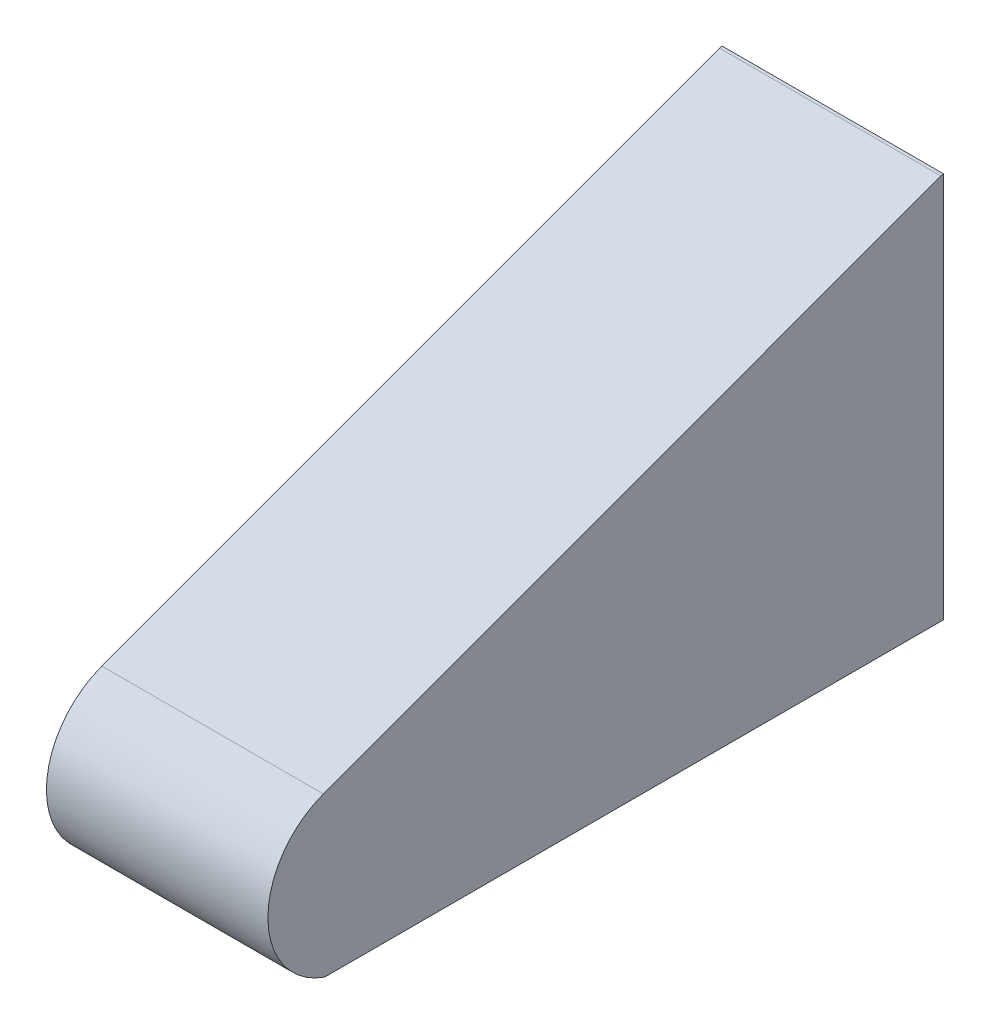
ISO-10303-21;
HEADER;
FILE_DESCRIPTION(('STEP AP214'),'2;1');
FILE_NAME('part.step','',(''),(''),'','','');
FILE_SCHEMA(('AUTOMOTIVE_DESIGN { 1 0 10303 214 1 1 1 1 }'));
ENDSEC;
DATA;
#1=APPLICATION_CONTEXT('core data for automotive mechanical design processes');
#2=APPLICATION_PROTOCOL_DEFINITION('international standard','automotive_design',2000,#1);
#3=PRODUCT_CONTEXT('',#1,'mechanical');
#4=PRODUCT('Part','Part','',(#3));
#5=PRODUCT_RELATED_PRODUCT_CATEGORY('part','',(#4));
#6=PRODUCT_DEFINITION_FORMATION('','',#4);
#7=PRODUCT_DEFINITION_CONTEXT('part definition',#1,'design');
#8=PRODUCT_DEFINITION('design','',#6,#7);
#9=PRODUCT_DEFINITION_SHAPE('','',#8);
#10=(LENGTH_UNIT() NAMED_UNIT(*) SI_UNIT(.MILLI.,.METRE.));
#11=(NAMED_UNIT(*) PLANE_ANGLE_UNIT() SI_UNIT($,.RADIAN.));
#12=(NAMED_UNIT(*) SI_UNIT($,.STERADIAN.) SOLID_ANGLE_UNIT());
#13=UNCERTAINTY_MEASURE_WITH_UNIT(LENGTH_MEASURE(1.E-05),#10,'distance_accuracy_value','');
#14=(GEOMETRIC_REPRESENTATION_CONTEXT(3) GLOBAL_UNCERTAINTY_ASSIGNED_CONTEXT((#13)) GLOBAL_UNIT_ASSIGNED_CONTEXT((#10,
#11,#12)) REPRESENTATION_CONTEXT('',''));
#15=CARTESIAN_POINT('',(0.,0.,0.));
#16=DIRECTION('',(0.,0.,1.));
#17=DIRECTION('',(1.,0.,0.));
#18=AXIS2_PLACEMENT_3D('',#15,#16,#17);
#19=CARTESIAN_POINT('',(-63.5,-119.126,0.));
#20=DIRECTION('',(0.,-1.,0.));
#21=DIRECTION('',(0.,0.,-1.));
#22=AXIS2_PLACEMENT_3D('',#19,#20,#21);
#23=PLANE('',#22);
#24=DIRECTION('',(1.,0.,0.));
#25=VECTOR('',#24,1.);
#26=CARTESIAN_POINT('',(-63.5,-119.126,0.));
#27=LINE('',#26,#25);
#28=CARTESIAN_POINT('',(-68.326,-119.126,0.));
#29=VERTEX_POINT('',#28);
#30=CARTESIAN_POINT('',(68.326,-119.126,0.));
#31=VERTEX_POINT('',#30);
#32=EDGE_CURVE('E11',#29,#31,#27,.T.);
#33=ORIENTED_EDGE('',*,*,#32,.T.);
#34=DIRECTION('',(0.,0.,-1.));
#35=VECTOR('',#34,1.);
#36=CARTESIAN_POINT('',(68.326,-119.126,381.835461036486));
#37=LINE('',#36,#35);
#38=CARTESIAN_POINT('',(68.326,-119.126,381.835461036486));
#39=VERTEX_POINT('',#38);
#40=EDGE_CURVE('E157',#39,#31,#37,.T.);
#41=ORIENTED_EDGE('',*,*,#40,.F.);
#42=DIRECTION('',(1.,0.,0.));
#43=VECTOR('',#42,1.);
#44=CARTESIAN_POINT('',(-63.5,-119.126,381.835461036486));
#45=LINE('',#44,#43);
#46=CARTESIAN_POINT('',(-68.326,-119.126,381.835461036486));
#47=VERTEX_POINT('',#46);
#48=EDGE_CURVE('E49',#47,#39,#45,.T.);
#49=ORIENTED_EDGE('',*,*,#48,.F.);
#50=DIRECTION('',(0.,0.,-1.));
#51=VECTOR('',#50,1.);
#52=CARTESIAN_POINT('',(-68.326,-119.126,381.835461036486));
#53=LINE('',#52,#51);
#54=EDGE_CURVE('E135',#47,#29,#53,.T.);
#55=ORIENTED_EDGE('',*,*,#54,.T.);
#56=EDGE_LOOP('',(#33,#41,#49,#55));
#57=FACE_BOUND('',#56,.T.);
#58=ADVANCED_FACE('F39',(#57),#23,.T.);
#59=CARTESIAN_POINT('',(-63.5,-69.8500000000001,364.701666666667));
#60=DIRECTION('',(1.,0.,0.));
#61=DIRECTION('',(0.,0.,-1.));
#62=AXIS2_PLACEMENT_3D('',#59,#60,#61);
#63=CYLINDRICAL_SURFACE('',#62,52.1698292646935);
#64=ORIENTED_EDGE('',*,*,#48,.T.);
#65=CARTESIAN_POINT('',(68.326,-69.8500000000001,364.701666666667));
#66=DIRECTION('',(1.,0.,0.));
#67=DIRECTION('',(0.,0.,-1.));
#68=AXIS2_PLACEMENT_3D('',#65,#66,#67);
#69=CIRCLE('',#68,52.1698292646935);
#70=CARTESIAN_POINT('',(68.326,-20.8689828995313,382.661372936839));
#71=VERTEX_POINT('',#70);
#72=EDGE_CURVE('E119',#71,#39,#69,.T.);
#73=ORIENTED_EDGE('',*,*,#72,.F.);
#74=DIRECTION('',(1.,0.,0.));
#75=VECTOR('',#74,1.);
#76=CARTESIAN_POINT('',(-63.5,-20.8689828995313,382.661372936839));
#77=LINE('',#76,#75);
#78=CARTESIAN_POINT('',(-68.326,-20.8689828995313,382.661372936839));
#79=VERTEX_POINT('',#78);
#80=EDGE_CURVE('E113',#79,#71,#77,.T.);
#81=ORIENTED_EDGE('',*,*,#80,.F.);
#82=CARTESIAN_POINT('',(-68.326,-69.8500000000001,364.701666666667));
#83=DIRECTION('',(1.,0.,0.));
#84=DIRECTION('',(0.,0.,-1.));
#85=AXIS2_PLACEMENT_3D('',#82,#83,#84);
#86=CIRCLE('',#85,52.1698292646935);
#87=EDGE_CURVE('E116',#79,#47,#86,.T.);
#88=ORIENTED_EDGE('',*,*,#87,.T.);
#89=EDGE_LOOP('',(#64,#73,#81,#88));
#90=FACE_BOUND('',#89,.T.);
#91=ADVANCED_FACE('F115',(#90),#63,.T.);
#92=CARTESIAN_POINT('',(-63.5,-20.8689828995313,382.661372936839));
#93=DIRECTION('',(0.,0.938876315886608,0.344254649158423));
#94=DIRECTION('',(0.,-0.344254649158423,0.938876315886609));
#95=AXIS2_PLACEMENT_3D('',#92,#93,#94);
#96=PLANE('',#95);
#97=ORIENTED_EDGE('',*,*,#80,.T.);
#98=DIRECTION('',(0.,-0.344254649158423,0.938876315886609));
#99=VECTOR('',#98,1.);
#100=CARTESIAN_POINT('',(68.326,118.831017100469,1.6613729368385));
#101=LINE('',#100,#99);
#102=CARTESIAN_POINT('',(68.326,118.831017100469,1.6613729368385));
#103=VERTEX_POINT('',#102);
#104=EDGE_CURVE('E169',#103,#71,#101,.T.);
#105=ORIENTED_EDGE('',*,*,#104,.F.);
#106=DIRECTION('',(1.,0.,0.));
#107=VECTOR('',#106,1.);
#108=CARTESIAN_POINT('',(-63.5,118.831017100469,1.6613729368385));
#109=LINE('',#108,#107);
#110=CARTESIAN_POINT('',(-68.326,118.831017100469,1.6613729368385));
#111=VERTEX_POINT('',#110);
#112=EDGE_CURVE('E125',#111,#103,#109,.T.);
#113=ORIENTED_EDGE('',*,*,#112,.F.);
#114=DIRECTION('',(0.,-0.344254649158423,0.938876315886609));
#115=VECTOR('',#114,1.);
#116=CARTESIAN_POINT('',(-68.326,118.831017100469,1.6613729368385));
#117=LINE('',#116,#115);
#118=EDGE_CURVE('E131',#111,#79,#117,.T.);
#119=ORIENTED_EDGE('',*,*,#118,.T.);
#120=EDGE_LOOP('',(#97,#105,#113,#119));
#121=FACE_BOUND('',#120,.T.);
#122=ADVANCED_FACE('F139',(#121),#96,.T.);
#123=CARTESIAN_POINT('',(-63.5,118.831017100469,1.6613729368385));
#124=DIRECTION('',(0.,0.984600506775875,0.174819455601169));
#125=DIRECTION('',(0.,-0.174819455601169,0.984600506775876));
#126=AXIS2_PLACEMENT_3D('',#123,#124,#125);
#127=PLANE('',#126);
#128=ORIENTED_EDGE('',*,*,#112,.T.);
#129=DIRECTION('',(0.,-0.174819455601169,0.984600506775875));
#130=VECTOR('',#129,1.);
#131=CARTESIAN_POINT('',(68.326,119.126,0.));
#132=LINE('',#131,#130);
#133=CARTESIAN_POINT('',(68.326,119.126,0.));
#134=VERTEX_POINT('',#133);
#135=EDGE_CURVE('E165',#134,#103,#132,.T.);
#136=ORIENTED_EDGE('',*,*,#135,.F.);
#137=DIRECTION('',(1.,0.,0.));
#138=VECTOR('',#137,1.);
#139=CARTESIAN_POINT('',(-63.5,119.126,0.));
#140=LINE('',#139,#138);
#141=CARTESIAN_POINT('',(-68.326,119.126,0.));
#142=VERTEX_POINT('',#141);
#143=EDGE_CURVE('E201',#142,#134,#140,.T.);
#144=ORIENTED_EDGE('',*,*,#143,.F.);
#145=DIRECTION('',(0.,-0.174819455601169,0.984600506775875));
#146=VECTOR('',#145,1.);
#147=CARTESIAN_POINT('',(-68.326,119.126,0.));
#148=LINE('',#147,#146);
#149=EDGE_CURVE('E141',#142,#111,#148,.T.);
#150=ORIENTED_EDGE('',*,*,#149,.T.);
#151=EDGE_LOOP('',(#128,#136,#144,#150));
#152=FACE_BOUND('',#151,.T.);
#153=ADVANCED_FACE('F244',(#152),#127,.T.);
#154=CARTESIAN_POINT('',(-63.5,114.3,0.));
#155=DIRECTION('',(0.,0.,-1.));
#156=DIRECTION('',(-1.,0.,0.));
#157=AXIS2_PLACEMENT_3D('',#154,#155,#156);
#158=PLANE('',#157);
#159=DIRECTION('',(0.,1.,0.));
#160=VECTOR('',#159,1.);
#161=CARTESIAN_POINT('',(-63.5,119.126,0.));
#162=LINE('',#161,#160);
#163=CARTESIAN_POINT('',(-63.5,-114.3,0.));
#164=VERTEX_POINT('',#163);
#165=CARTESIAN_POINT('',(-63.5,114.3,0.));
#166=VERTEX_POINT('',#165);
#167=EDGE_CURVE('E137',#164,#166,#162,.T.);
#168=ORIENTED_EDGE('',*,*,#167,.F.);
#169=DIRECTION('',(1.,0.,0.));
#170=VECTOR('',#169,1.);
#171=CARTESIAN_POINT('',(-63.5,-114.3,0.));
#172=LINE('',#171,#170);
#173=CARTESIAN_POINT('',(63.5,-114.3,0.));
#174=VERTEX_POINT('',#173);
#175=EDGE_CURVE('E43',#164,#174,#172,.T.);
#176=ORIENTED_EDGE('',*,*,#175,.T.);
#177=DIRECTION('',(0.,1.,0.));
#178=VECTOR('',#177,1.);
#179=CARTESIAN_POINT('',(63.5,119.126,0.));
#180=LINE('',#179,#178);
#181=CARTESIAN_POINT('',(63.5,114.3,0.));
#182=VERTEX_POINT('',#181);
#183=EDGE_CURVE('E152',#174,#182,#180,.T.);
#184=ORIENTED_EDGE('',*,*,#183,.T.);
#185=DIRECTION('',(1.,0.,0.));
#186=VECTOR('',#185,1.);
#187=CARTESIAN_POINT('',(-63.5,114.3,0.));
#188=LINE('',#187,#186);
#189=EDGE_CURVE('E204',#166,#182,#188,.T.);
#190=ORIENTED_EDGE('',*,*,#189,.F.);
#191=EDGE_LOOP('',(#168,#176,#184,#190));
#192=FACE_BOUND('',#191,.T.);
#193=ORIENTED_EDGE('',*,*,#143,.T.);
#194=DIRECTION('',(0.,1.,0.));
#195=VECTOR('',#194,1.);
#196=CARTESIAN_POINT('',(68.326,119.126,0.));
#197=LINE('',#196,#195);
#198=EDGE_CURVE('E161',#31,#134,#197,.T.);
#199=ORIENTED_EDGE('',*,*,#198,.F.);
#200=ORIENTED_EDGE('',*,*,#32,.F.);
#201=DIRECTION('',(0.,1.,0.));
#202=VECTOR('',#201,1.);
#203=CARTESIAN_POINT('',(-68.326,119.126,0.));
#204=LINE('',#203,#202);
#205=EDGE_CURVE('E144',#29,#142,#204,.T.);
#206=ORIENTED_EDGE('',*,*,#205,.T.);
#207=EDGE_LOOP('',(#193,#199,#200,#206));
#208=FACE_BOUND('',#207,.T.);
#209=ADVANCED_FACE('F216',(#192,#208),#158,.T.);
#210=CARTESIAN_POINT('',(-63.5,-25.4,381.));
#211=DIRECTION('',(0.,-0.938876315886609,-0.344254649158423));
#212=DIRECTION('',(0.,0.344254649158423,-0.938876315886609));
#213=AXIS2_PLACEMENT_3D('',#210,#211,#212);
#214=PLANE('',#213);
#215=ORIENTED_EDGE('',*,*,#189,.T.);
#216=DIRECTION('',(0.,0.344254649158423,-0.938876315886609));
#217=VECTOR('',#216,1.);
#218=CARTESIAN_POINT('',(63.5,-25.4,381.));
#219=LINE('',#218,#217);
#220=CARTESIAN_POINT('',(63.5,-25.4000000000001,381.));
#221=VERTEX_POINT('',#220);
#222=EDGE_CURVE('E183',#221,#182,#219,.T.);
#223=ORIENTED_EDGE('',*,*,#222,.F.);
#224=DIRECTION('',(1.,0.,0.));
#225=VECTOR('',#224,1.);
#226=CARTESIAN_POINT('',(-63.5,-25.4000000000001,381.));
#227=LINE('',#226,#225);
#228=CARTESIAN_POINT('',(-63.5,-25.4000000000001,381.));
#229=VERTEX_POINT('',#228);
#230=EDGE_CURVE('E64',#229,#221,#227,.T.);
#231=ORIENTED_EDGE('',*,*,#230,.F.);
#232=DIRECTION('',(0.,0.344254649158423,-0.938876315886609));
#233=VECTOR('',#232,1.);
#234=CARTESIAN_POINT('',(-63.5,-25.4,381.));
#235=LINE('',#234,#233);
#236=EDGE_CURVE('E193',#229,#166,#235,.T.);
#237=ORIENTED_EDGE('',*,*,#236,.T.);
#238=EDGE_LOOP('',(#215,#223,#231,#237));
#239=FACE_BOUND('',#238,.T.);
#240=ADVANCED_FACE('F223',(#239),#214,.T.);
#241=CARTESIAN_POINT('',(-63.5,-69.8500000000001,364.701666666667));
#242=DIRECTION('',(1.,0.,0.));
#243=DIRECTION('',(0.,0.,-1.));
#244=AXIS2_PLACEMENT_3D('',#241,#242,#243);
#245=CYLINDRICAL_SURFACE('',#244,47.3438292646935);
#246=ORIENTED_EDGE('',*,*,#230,.T.);
#247=CARTESIAN_POINT('',(63.5,-69.8500000000001,364.701666666667));
#248=DIRECTION('',(-1.,0.,0.));
#249=DIRECTION('',(0.,0.,-1.));
#250=AXIS2_PLACEMENT_3D('',#247,#248,#249);
#251=CIRCLE('',#250,47.3438292646935);
#252=CARTESIAN_POINT('',(63.5,-114.3,381.));
#253=VERTEX_POINT('',#252);
#254=EDGE_CURVE('E179',#253,#221,#251,.T.);
#255=ORIENTED_EDGE('',*,*,#254,.F.);
#256=DIRECTION('',(1.,0.,0.));
#257=VECTOR('',#256,1.);
#258=CARTESIAN_POINT('',(-63.5,-114.3,381.));
#259=LINE('',#258,#257);
#260=CARTESIAN_POINT('',(-63.5,-114.3,381.));
#261=VERTEX_POINT('',#260);
#262=EDGE_CURVE('E208',#261,#253,#259,.T.);
#263=ORIENTED_EDGE('',*,*,#262,.F.);
#264=CARTESIAN_POINT('',(-63.5,-69.8500000000001,364.701666666667));
#265=DIRECTION('',(-1.,0.,0.));
#266=DIRECTION('',(0.,0.,-1.));
#267=AXIS2_PLACEMENT_3D('',#264,#265,#266);
#268=CIRCLE('',#267,47.3438292646935);
#269=EDGE_CURVE('E57',#261,#229,#268,.T.);
#270=ORIENTED_EDGE('',*,*,#269,.T.);
#271=EDGE_LOOP('',(#246,#255,#263,#270));
#272=FACE_BOUND('',#271,.T.);
#273=ADVANCED_FACE('F251',(#272),#245,.F.);
#274=CARTESIAN_POINT('',(-63.5,-114.3,0.));
#275=DIRECTION('',(0.,1.,0.));
#276=DIRECTION('',(0.,0.,1.));
#277=AXIS2_PLACEMENT_3D('',#274,#275,#276);
#278=PLANE('',#277);
#279=ORIENTED_EDGE('',*,*,#262,.T.);
#280=DIRECTION('',(0.,0.,1.));
#281=VECTOR('',#280,1.);
#282=CARTESIAN_POINT('',(63.5,-114.3,0.));
#283=LINE('',#282,#281);
#284=EDGE_CURVE('E172',#174,#253,#283,.T.);
#285=ORIENTED_EDGE('',*,*,#284,.F.);
#286=ORIENTED_EDGE('',*,*,#175,.F.);
#287=DIRECTION('',(0.,0.,1.));
#288=VECTOR('',#287,1.);
#289=CARTESIAN_POINT('',(-63.5,-114.3,0.));
#290=LINE('',#289,#288);
#291=EDGE_CURVE('E187',#164,#261,#290,.T.);
#292=ORIENTED_EDGE('',*,*,#291,.T.);
#293=EDGE_LOOP('',(#279,#285,#286,#292));
#294=FACE_BOUND('',#293,.T.);
#295=ADVANCED_FACE('F41',(#294),#278,.T.);
#296=CARTESIAN_POINT('',(63.5,-69.8500000000001,364.701666666667));
#297=DIRECTION('',(1.,0.,0.));
#298=DIRECTION('',(0.,0.,-1.));
#299=AXIS2_PLACEMENT_3D('',#296,#297,#298);
#300=PLANE('',#299);
#301=ORIENTED_EDGE('',*,*,#183,.F.);
#302=ORIENTED_EDGE('',*,*,#284,.T.);
#303=ORIENTED_EDGE('',*,*,#254,.T.);
#304=ORIENTED_EDGE('',*,*,#222,.T.);
#305=EDGE_LOOP('',(#301,#302,#303,#304));
#306=FACE_BOUND('',#305,.T.);
#307=ADVANCED_FACE('F221',(#306),#300,.F.);
#308=CARTESIAN_POINT('',(68.326,-69.8500000000001,364.701666666667));
#309=DIRECTION('',(1.,0.,0.));
#310=DIRECTION('',(0.,0.,-1.));
#311=AXIS2_PLACEMENT_3D('',#308,#309,#310);
#312=PLANE('',#311);
#313=ORIENTED_EDGE('',*,*,#72,.T.);
#314=ORIENTED_EDGE('',*,*,#40,.T.);
#315=ORIENTED_EDGE('',*,*,#198,.T.);
#316=ORIENTED_EDGE('',*,*,#135,.T.);
#317=ORIENTED_EDGE('',*,*,#104,.T.);
#318=EDGE_LOOP('',(#313,#314,#315,#316,#317));
#319=FACE_BOUND('',#318,.T.);
#320=ADVANCED_FACE('F230',(#319),#312,.T.);
#321=CARTESIAN_POINT('',(-68.326,-69.8500000000001,364.701666666667));
#322=DIRECTION('',(-1.,0.,0.));
#323=DIRECTION('',(0.,0.,-1.));
#324=AXIS2_PLACEMENT_3D('',#321,#322,#323);
#325=PLANE('',#324);
#326=ORIENTED_EDGE('',*,*,#87,.F.);
#327=ORIENTED_EDGE('',*,*,#118,.F.);
#328=ORIENTED_EDGE('',*,*,#149,.F.);
#329=ORIENTED_EDGE('',*,*,#205,.F.);
#330=ORIENTED_EDGE('',*,*,#54,.F.);
#331=EDGE_LOOP('',(#326,#327,#328,#329,#330));
#332=FACE_BOUND('',#331,.T.);
#333=ADVANCED_FACE('F129',(#332),#325,.T.);
#334=CARTESIAN_POINT('',(-63.5,-69.8500000000001,364.701666666667));
#335=DIRECTION('',(-1.,0.,0.));
#336=DIRECTION('',(0.,0.,-1.));
#337=AXIS2_PLACEMENT_3D('',#334,#335,#336);
#338=PLANE('',#337);
#339=ORIENTED_EDGE('',*,*,#236,.F.);
#340=ORIENTED_EDGE('',*,*,#269,.F.);
#341=ORIENTED_EDGE('',*,*,#291,.F.);
#342=ORIENTED_EDGE('',*,*,#167,.T.);
#343=EDGE_LOOP('',(#339,#340,#341,#342));
#344=FACE_BOUND('',#343,.T.);
#345=ADVANCED_FACE('F224',(#344),#338,.F.);
#346=CLOSED_SHELL('',(#58,#91,#122,#153,#209,#240,#273,#295,#307,#320,#333,#345));
#347=MANIFOLD_SOLID_BREP('B2',#346);
#348=ADVANCED_BREP_SHAPE_REPRESENTATION('',(#18,#347),#14);
#349=SHAPE_DEFINITION_REPRESENTATION(#9,#348);
ENDSEC;
END-ISO-10303-21;
